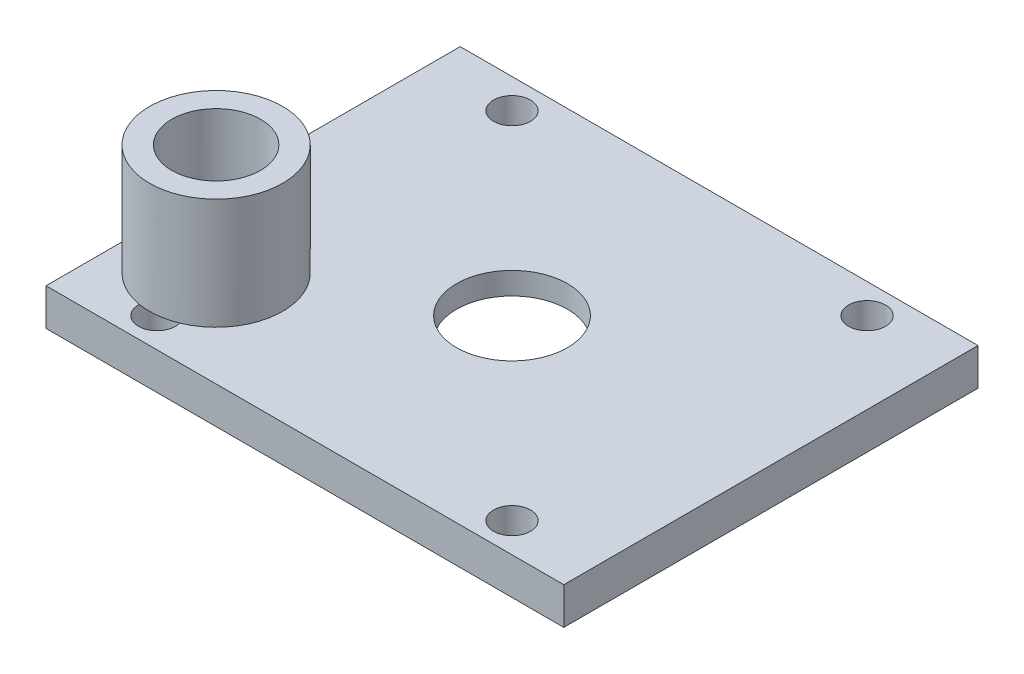
ISO-10303-21;
HEADER;
FILE_DESCRIPTION(('STEP AP214'),'2;1');
FILE_NAME('part.step','',(''),(''),'','','');
FILE_SCHEMA(('AUTOMOTIVE_DESIGN { 1 0 10303 214 1 1 1 1 }'));
ENDSEC;
DATA;
#1=APPLICATION_CONTEXT('core data for automotive mechanical design processes');
#2=APPLICATION_PROTOCOL_DEFINITION('international standard','automotive_design',2000,#1);
#3=PRODUCT_CONTEXT('',#1,'mechanical');
#4=PRODUCT('Part','Part','',(#3));
#5=PRODUCT_RELATED_PRODUCT_CATEGORY('part','',(#4));
#6=PRODUCT_DEFINITION_FORMATION('','',#4);
#7=PRODUCT_DEFINITION_CONTEXT('part definition',#1,'design');
#8=PRODUCT_DEFINITION('design','',#6,#7);
#9=PRODUCT_DEFINITION_SHAPE('','',#8);
#10=(LENGTH_UNIT() NAMED_UNIT(*) SI_UNIT(.MILLI.,.METRE.));
#11=(NAMED_UNIT(*) PLANE_ANGLE_UNIT() SI_UNIT($,.RADIAN.));
#12=(NAMED_UNIT(*) SI_UNIT($,.STERADIAN.) SOLID_ANGLE_UNIT());
#13=UNCERTAINTY_MEASURE_WITH_UNIT(LENGTH_MEASURE(1.E-05),#10,'distance_accuracy_value','');
#14=(GEOMETRIC_REPRESENTATION_CONTEXT(3) GLOBAL_UNCERTAINTY_ASSIGNED_CONTEXT((#13)) GLOBAL_UNIT_ASSIGNED_CONTEXT((#10,
#11,#12)) REPRESENTATION_CONTEXT('',''));
#15=CARTESIAN_POINT('',(0.,0.,0.));
#16=DIRECTION('',(0.,0.,1.));
#17=DIRECTION('',(1.,0.,0.));
#18=AXIS2_PLACEMENT_3D('',#15,#16,#17);
#19=CARTESIAN_POINT('',(35.,5.,28.));
#20=DIRECTION('',(-1.,0.,0.));
#21=DIRECTION('',(0.,0.,1.));
#22=AXIS2_PLACEMENT_3D('',#19,#20,#21);
#23=PLANE('',#22);
#24=DIRECTION('',(0.,0.,-1.));
#25=VECTOR('',#24,1.);
#26=CARTESIAN_POINT('',(35.,0.,28.));
#27=LINE('',#26,#25);
#28=CARTESIAN_POINT('',(35.,0.,28.));
#29=VERTEX_POINT('',#28);
#30=CARTESIAN_POINT('',(35.,0.,-28.));
#31=VERTEX_POINT('',#30);
#32=EDGE_CURVE('E133',#29,#31,#27,.T.);
#33=ORIENTED_EDGE('',*,*,#32,.T.);
#34=DIRECTION('',(0.,-1.,0.));
#35=VECTOR('',#34,1.);
#36=CARTESIAN_POINT('',(35.,5.,-28.));
#37=LINE('',#36,#35);
#38=CARTESIAN_POINT('',(35.,5.,-28.));
#39=VERTEX_POINT('',#38);
#40=EDGE_CURVE('E110',#39,#31,#37,.T.);
#41=ORIENTED_EDGE('',*,*,#40,.F.);
#42=DIRECTION('',(0.,0.,-1.));
#43=VECTOR('',#42,1.);
#44=CARTESIAN_POINT('',(35.,5.,28.));
#45=LINE('',#44,#43);
#46=CARTESIAN_POINT('',(35.,5.,28.));
#47=VERTEX_POINT('',#46);
#48=EDGE_CURVE('E126',#47,#39,#45,.T.);
#49=ORIENTED_EDGE('',*,*,#48,.F.);
#50=DIRECTION('',(0.,-1.,0.));
#51=VECTOR('',#50,1.);
#52=CARTESIAN_POINT('',(35.,5.,28.));
#53=LINE('',#52,#51);
#54=EDGE_CURVE('E121',#47,#29,#53,.T.);
#55=ORIENTED_EDGE('',*,*,#54,.T.);
#56=EDGE_LOOP('',(#33,#41,#49,#55));
#57=FACE_BOUND('',#56,.T.);
#58=ADVANCED_FACE('F39',(#57),#23,.F.);
#59=CARTESIAN_POINT('',(-35.,5.,-28.));
#60=DIRECTION('',(0.,0.,1.));
#61=DIRECTION('',(1.,0.,0.));
#62=AXIS2_PLACEMENT_3D('',#59,#60,#61);
#63=PLANE('',#62);
#64=DIRECTION('',(-1.,0.,0.));
#65=VECTOR('',#64,1.);
#66=CARTESIAN_POINT('',(-35.,0.,-28.));
#67=LINE('',#66,#65);
#68=CARTESIAN_POINT('',(-35.,0.,-28.));
#69=VERTEX_POINT('',#68);
#70=EDGE_CURVE('E130',#31,#69,#67,.T.);
#71=ORIENTED_EDGE('',*,*,#70,.T.);
#72=DIRECTION('',(0.,-1.,0.));
#73=VECTOR('',#72,1.);
#74=CARTESIAN_POINT('',(-35.,5.,-28.));
#75=LINE('',#74,#73);
#76=CARTESIAN_POINT('',(-35.,5.,-28.));
#77=VERTEX_POINT('',#76);
#78=EDGE_CURVE('E112',#77,#69,#75,.T.);
#79=ORIENTED_EDGE('',*,*,#78,.F.);
#80=DIRECTION('',(-1.,0.,0.));
#81=VECTOR('',#80,1.);
#82=CARTESIAN_POINT('',(-35.,5.,-28.));
#83=LINE('',#82,#81);
#84=EDGE_CURVE('E92',#39,#77,#83,.T.);
#85=ORIENTED_EDGE('',*,*,#84,.F.);
#86=ORIENTED_EDGE('',*,*,#40,.T.);
#87=EDGE_LOOP('',(#71,#79,#85,#86));
#88=FACE_BOUND('',#87,.T.);
#89=ADVANCED_FACE('F236',(#88),#63,.F.);
#90=CARTESIAN_POINT('',(-35.,5.,28.));
#91=DIRECTION('',(1.,0.,0.));
#92=DIRECTION('',(0.,0.,-1.));
#93=AXIS2_PLACEMENT_3D('',#90,#91,#92);
#94=PLANE('',#93);
#95=DIRECTION('',(0.,0.,1.));
#96=VECTOR('',#95,1.);
#97=CARTESIAN_POINT('',(-35.,0.,28.));
#98=LINE('',#97,#96);
#99=CARTESIAN_POINT('',(-35.,0.,28.));
#100=VERTEX_POINT('',#99);
#101=EDGE_CURVE('E127',#69,#100,#98,.T.);
#102=ORIENTED_EDGE('',*,*,#101,.T.);
#103=DIRECTION('',(0.,-1.,0.));
#104=VECTOR('',#103,1.);
#105=CARTESIAN_POINT('',(-35.,5.,28.));
#106=LINE('',#105,#104);
#107=CARTESIAN_POINT('',(-35.,5.,28.));
#108=VERTEX_POINT('',#107);
#109=EDGE_CURVE('E118',#108,#100,#106,.T.);
#110=ORIENTED_EDGE('',*,*,#109,.F.);
#111=DIRECTION('',(0.,0.,1.));
#112=VECTOR('',#111,1.);
#113=CARTESIAN_POINT('',(-35.,5.,28.));
#114=LINE('',#113,#112);
#115=EDGE_CURVE('E140',#77,#108,#114,.T.);
#116=ORIENTED_EDGE('',*,*,#115,.F.);
#117=ORIENTED_EDGE('',*,*,#78,.T.);
#118=EDGE_LOOP('',(#102,#110,#116,#117));
#119=FACE_BOUND('',#118,.T.);
#120=ADVANCED_FACE('F241',(#119),#94,.F.);
#121=CARTESIAN_POINT('',(-35.,5.,28.));
#122=DIRECTION('',(0.,0.,-1.));
#123=DIRECTION('',(-1.,0.,0.));
#124=AXIS2_PLACEMENT_3D('',#121,#122,#123);
#125=PLANE('',#124);
#126=DIRECTION('',(1.,0.,0.));
#127=VECTOR('',#126,1.);
#128=CARTESIAN_POINT('',(-35.,0.,28.));
#129=LINE('',#128,#127);
#130=EDGE_CURVE('E84',#100,#29,#129,.T.);
#131=ORIENTED_EDGE('',*,*,#130,.T.);
#132=ORIENTED_EDGE('',*,*,#54,.F.);
#133=DIRECTION('',(1.,0.,0.));
#134=VECTOR('',#133,1.);
#135=CARTESIAN_POINT('',(-35.,5.,28.));
#136=LINE('',#135,#134);
#137=EDGE_CURVE('E63',#108,#47,#136,.T.);
#138=ORIENTED_EDGE('',*,*,#137,.F.);
#139=ORIENTED_EDGE('',*,*,#109,.T.);
#140=EDGE_LOOP('',(#131,#132,#138,#139));
#141=FACE_BOUND('',#140,.T.);
#142=ADVANCED_FACE('F211',(#141),#125,.F.);
#143=CARTESIAN_POINT('',(0.,5.,0.));
#144=DIRECTION('',(0.,-1.,0.));
#145=DIRECTION('',(0.,0.,-1.));
#146=AXIS2_PLACEMENT_3D('',#143,#144,#145);
#147=PLANE('',#146);
#148=CARTESIAN_POINT('',(24.0000000000014,5.,23.9999999999986));
#149=DIRECTION('',(0.,1.,0.));
#150=DIRECTION('',(0.,0.,1.));
#151=AXIS2_PLACEMENT_3D('',#148,#149,#150);
#152=CIRCLE('',#151,2.5000000000019);
#153=CARTESIAN_POINT('',(24.0000000000014,5.,26.5000000000005));
#154=VERTEX_POINT('',#153);
#155=EDGE_CURVE('E182',#154,#154,#152,.T.);
#156=ORIENTED_EDGE('',*,*,#155,.F.);
#157=EDGE_LOOP('',(#156));
#158=FACE_BOUND('',#157,.T.);
#159=CARTESIAN_POINT('',(24.,5.,-24.0000000000014));
#160=DIRECTION('',(0.,1.,0.));
#161=DIRECTION('',(0.,0.,1.));
#162=AXIS2_PLACEMENT_3D('',#159,#160,#161);
#163=CIRCLE('',#162,2.5000000000014);
#164=CARTESIAN_POINT('',(24.,5.,-21.5));
#165=VERTEX_POINT('',#164);
#166=EDGE_CURVE('E190',#165,#165,#163,.T.);
#167=ORIENTED_EDGE('',*,*,#166,.F.);
#168=EDGE_LOOP('',(#167));
#169=FACE_BOUND('',#168,.T.);
#170=CARTESIAN_POINT('',(-24.,5.,-24.));
#171=DIRECTION('',(0.,1.,0.));
#172=DIRECTION('',(0.,0.,1.));
#173=AXIS2_PLACEMENT_3D('',#170,#171,#172);
#174=CIRCLE('',#173,2.5);
#175=CARTESIAN_POINT('',(-24.,5.,-21.5));
#176=VERTEX_POINT('',#175);
#177=EDGE_CURVE('E171',#176,#176,#174,.T.);
#178=ORIENTED_EDGE('',*,*,#177,.F.);
#179=EDGE_LOOP('',(#178));
#180=FACE_BOUND('',#179,.T.);
#181=CARTESIAN_POINT('',(0.,5.,0.));
#182=DIRECTION('',(0.,-1.,0.));
#183=DIRECTION('',(0.,0.,-1.));
#184=AXIS2_PLACEMENT_3D('',#181,#182,#183);
#185=CIRCLE('',#184,7.5);
#186=CARTESIAN_POINT('',(0.,5.,-7.5));
#187=VERTEX_POINT('',#186);
#188=EDGE_CURVE('E155',#187,#187,#185,.T.);
#189=ORIENTED_EDGE('',*,*,#188,.T.);
#190=EDGE_LOOP('',(#189));
#191=FACE_BOUND('',#190,.T.);
#192=CARTESIAN_POINT('',(-25.,5.,15.));
#193=DIRECTION('',(0.,-1.,0.));
#194=DIRECTION('',(0.,0.,-1.));
#195=AXIS2_PLACEMENT_3D('',#192,#193,#194);
#196=CIRCLE('',#195,9.);
#197=CARTESIAN_POINT('',(-21.5915591053831,5.,23.3296176783753));
#198=VERTEX_POINT('',#197);
#199=CARTESIAN_POINT('',(-26.4968555287608,5.,23.8746506143069));
#200=VERTEX_POINT('',#199);
#201=EDGE_CURVE('E48',#198,#200,#196,.F.);
#202=ORIENTED_EDGE('',*,*,#201,.F.);
#203=CARTESIAN_POINT('',(-23.9999999999986,5.,24.));
#204=DIRECTION('',(0.,1.,0.));
#205=DIRECTION('',(0.,0.,1.));
#206=AXIS2_PLACEMENT_3D('',#203,#204,#205);
#207=CIRCLE('',#206,2.50000000000071);
#208=EDGE_CURVE('E100',#200,#198,#207,.T.);
#209=ORIENTED_EDGE('',*,*,#208,.F.);
#210=EDGE_LOOP('',(#202,#209));
#211=FACE_BOUND('',#210,.T.);
#212=ORIENTED_EDGE('',*,*,#48,.T.);
#213=ORIENTED_EDGE('',*,*,#84,.T.);
#214=ORIENTED_EDGE('',*,*,#115,.T.);
#215=ORIENTED_EDGE('',*,*,#137,.T.);
#216=EDGE_LOOP('',(#212,#213,#214,#215));
#217=FACE_BOUND('',#216,.T.);
#218=ADVANCED_FACE('F106',(#158,#169,#180,#191,#211,#217),#147,.F.);
#219=CARTESIAN_POINT('',(0.,0.,0.));
#220=DIRECTION('',(0.,-1.,0.));
#221=DIRECTION('',(0.,0.,-1.));
#222=AXIS2_PLACEMENT_3D('',#219,#220,#221);
#223=PLANE('',#222);
#224=CARTESIAN_POINT('',(-23.9999999999986,0.,24.));
#225=DIRECTION('',(0.,1.,0.));
#226=DIRECTION('',(0.,0.,1.));
#227=AXIS2_PLACEMENT_3D('',#224,#225,#226);
#228=CIRCLE('',#227,2.50000000000071);
#229=CARTESIAN_POINT('',(-23.9999999999986,0.,26.5000000000007));
#230=VERTEX_POINT('',#229);
#231=EDGE_CURVE('E103',#230,#230,#228,.T.);
#232=ORIENTED_EDGE('',*,*,#231,.T.);
#233=EDGE_LOOP('',(#232));
#234=FACE_BOUND('',#233,.T.);
#235=CARTESIAN_POINT('',(24.0000000000014,0.,23.9999999999986));
#236=DIRECTION('',(0.,1.,0.));
#237=DIRECTION('',(0.,0.,1.));
#238=AXIS2_PLACEMENT_3D('',#235,#236,#237);
#239=CIRCLE('',#238,2.5000000000019);
#240=CARTESIAN_POINT('',(24.0000000000014,0.,26.5000000000005));
#241=VERTEX_POINT('',#240);
#242=EDGE_CURVE('E186',#241,#241,#239,.T.);
#243=ORIENTED_EDGE('',*,*,#242,.T.);
#244=EDGE_LOOP('',(#243));
#245=FACE_BOUND('',#244,.T.);
#246=CARTESIAN_POINT('',(24.,0.,-24.0000000000014));
#247=DIRECTION('',(0.,1.,0.));
#248=DIRECTION('',(0.,0.,1.));
#249=AXIS2_PLACEMENT_3D('',#246,#247,#248);
#250=CIRCLE('',#249,2.5000000000014);
#251=CARTESIAN_POINT('',(24.,0.,-21.5));
#252=VERTEX_POINT('',#251);
#253=EDGE_CURVE('E175',#252,#252,#250,.T.);
#254=ORIENTED_EDGE('',*,*,#253,.T.);
#255=EDGE_LOOP('',(#254));
#256=FACE_BOUND('',#255,.T.);
#257=CARTESIAN_POINT('',(-24.,0.,-24.));
#258=DIRECTION('',(0.,1.,0.));
#259=DIRECTION('',(0.,0.,1.));
#260=AXIS2_PLACEMENT_3D('',#257,#258,#259);
#261=CIRCLE('',#260,2.5);
#262=CARTESIAN_POINT('',(-24.,0.,-21.5));
#263=VERTEX_POINT('',#262);
#264=EDGE_CURVE('E170',#263,#263,#261,.T.);
#265=ORIENTED_EDGE('',*,*,#264,.T.);
#266=EDGE_LOOP('',(#265));
#267=FACE_BOUND('',#266,.T.);
#268=CARTESIAN_POINT('',(0.,0.,0.));
#269=DIRECTION('',(0.,-1.,0.));
#270=DIRECTION('',(0.,0.,-1.));
#271=AXIS2_PLACEMENT_3D('',#268,#269,#270);
#272=CIRCLE('',#271,19.);
#273=CARTESIAN_POINT('',(0.,0.,-19.));
#274=VERTEX_POINT('',#273);
#275=EDGE_CURVE('E151',#274,#274,#272,.T.);
#276=ORIENTED_EDGE('',*,*,#275,.F.);
#277=EDGE_LOOP('',(#276));
#278=FACE_BOUND('',#277,.T.);
#279=ORIENTED_EDGE('',*,*,#32,.F.);
#280=ORIENTED_EDGE('',*,*,#130,.F.);
#281=ORIENTED_EDGE('',*,*,#101,.F.);
#282=ORIENTED_EDGE('',*,*,#70,.F.);
#283=EDGE_LOOP('',(#279,#280,#281,#282));
#284=FACE_BOUND('',#283,.T.);
#285=ADVANCED_FACE('F198',(#234,#245,#256,#267,#278,#284),#223,.T.);
#286=CARTESIAN_POINT('',(-25.,20.,15.));
#287=DIRECTION('',(0.,-1.,0.));
#288=DIRECTION('',(0.,0.,-1.));
#289=AXIS2_PLACEMENT_3D('',#286,#287,#288);
#290=CYLINDRICAL_SURFACE('',#289,9.);
#291=CARTESIAN_POINT('',(-25.,20.,15.));
#292=DIRECTION('',(0.,1.,0.));
#293=DIRECTION('',(0.,0.,1.));
#294=AXIS2_PLACEMENT_3D('',#291,#292,#293);
#295=CIRCLE('',#294,9.);
#296=CARTESIAN_POINT('',(-25.,20.,24.));
#297=VERTEX_POINT('',#296);
#298=EDGE_CURVE('E137',#297,#297,#295,.T.);
#299=ORIENTED_EDGE('',*,*,#298,.F.);
#300=EDGE_LOOP('',(#299));
#301=FACE_BOUND('',#300,.T.);
#302=EDGE_CURVE('E11',#200,#198,#196,.F.);
#303=ORIENTED_EDGE('',*,*,#302,.T.);
#304=ORIENTED_EDGE('',*,*,#201,.T.);
#305=EDGE_LOOP('',(#303,#304));
#306=FACE_BOUND('',#305,.T.);
#307=ADVANCED_FACE('F108',(#301,#306),#290,.T.);
#308=CARTESIAN_POINT('',(-25.,20.,15.));
#309=DIRECTION('',(0.,1.,0.));
#310=DIRECTION('',(0.,0.,1.));
#311=AXIS2_PLACEMENT_3D('',#308,#309,#310);
#312=PLANE('',#311);
#313=CARTESIAN_POINT('',(-25.,20.,15.));
#314=DIRECTION('',(0.,1.,0.));
#315=DIRECTION('',(0.,0.,1.));
#316=AXIS2_PLACEMENT_3D('',#313,#314,#315);
#317=CIRCLE('',#316,6.);
#318=CARTESIAN_POINT('',(-25.,20.,21.));
#319=VERTEX_POINT('',#318);
#320=EDGE_CURVE('E166',#319,#319,#317,.T.);
#321=ORIENTED_EDGE('',*,*,#320,.F.);
#322=EDGE_LOOP('',(#321));
#323=FACE_BOUND('',#322,.T.);
#324=ORIENTED_EDGE('',*,*,#298,.T.);
#325=EDGE_LOOP('',(#324));
#326=FACE_BOUND('',#325,.T.);
#327=ADVANCED_FACE('F262',(#323,#326),#312,.T.);
#328=CARTESIAN_POINT('',(0.,2.,0.));
#329=DIRECTION('',(0.,-1.,0.));
#330=DIRECTION('',(0.,0.,-1.));
#331=AXIS2_PLACEMENT_3D('',#328,#329,#330);
#332=CYLINDRICAL_SURFACE('',#331,19.);
#333=CARTESIAN_POINT('',(0.,2.,0.));
#334=DIRECTION('',(0.,-1.,0.));
#335=DIRECTION('',(0.,0.,-1.));
#336=AXIS2_PLACEMENT_3D('',#333,#334,#335);
#337=CIRCLE('',#336,19.);
#338=CARTESIAN_POINT('',(0.,2.,-19.));
#339=VERTEX_POINT('',#338);
#340=EDGE_CURVE('E150',#339,#339,#337,.T.);
#341=ORIENTED_EDGE('',*,*,#340,.F.);
#342=EDGE_LOOP('',(#341));
#343=FACE_BOUND('',#342,.T.);
#344=ORIENTED_EDGE('',*,*,#275,.T.);
#345=EDGE_LOOP('',(#344));
#346=FACE_BOUND('',#345,.T.);
#347=ADVANCED_FACE('F231',(#343,#346),#332,.F.);
#348=CARTESIAN_POINT('',(0.,2.,0.));
#349=DIRECTION('',(0.,-1.,0.));
#350=DIRECTION('',(0.,0.,-1.));
#351=AXIS2_PLACEMENT_3D('',#348,#349,#350);
#352=PLANE('',#351);
#353=CARTESIAN_POINT('',(0.,2.,0.));
#354=DIRECTION('',(0.,-1.,0.));
#355=DIRECTION('',(0.,0.,-1.));
#356=AXIS2_PLACEMENT_3D('',#353,#354,#355);
#357=CIRCLE('',#356,7.5);
#358=CARTESIAN_POINT('',(0.,2.,-7.5));
#359=VERTEX_POINT('',#358);
#360=EDGE_CURVE('E42',#359,#359,#357,.T.);
#361=ORIENTED_EDGE('',*,*,#360,.F.);
#362=EDGE_LOOP('',(#361));
#363=FACE_BOUND('',#362,.T.);
#364=ORIENTED_EDGE('',*,*,#340,.T.);
#365=EDGE_LOOP('',(#364));
#366=FACE_BOUND('',#365,.T.);
#367=ADVANCED_FACE('F221',(#363,#366),#352,.T.);
#368=CARTESIAN_POINT('',(0.,20.,0.));
#369=DIRECTION('',(0.,-1.,0.));
#370=DIRECTION('',(0.,0.,-1.));
#371=AXIS2_PLACEMENT_3D('',#368,#369,#370);
#372=CYLINDRICAL_SURFACE('',#371,7.5);
#373=ORIENTED_EDGE('',*,*,#360,.T.);
#374=EDGE_LOOP('',(#373));
#375=FACE_BOUND('',#374,.T.);
#376=ORIENTED_EDGE('',*,*,#188,.F.);
#377=EDGE_LOOP('',(#376));
#378=FACE_BOUND('',#377,.T.);
#379=ADVANCED_FACE('F218',(#375,#378),#372,.F.);
#380=CARTESIAN_POINT('',(0.,5.,0.));
#381=DIRECTION('',(0.,-1.,0.));
#382=DIRECTION('',(0.,0.,-1.));
#383=AXIS2_PLACEMENT_3D('',#380,#381,#382);
#384=PLANE('',#383);
#385=CARTESIAN_POINT('',(-25.,5.,15.));
#386=DIRECTION('',(0.,-1.,0.));
#387=DIRECTION('',(0.,0.,-1.));
#388=AXIS2_PLACEMENT_3D('',#385,#386,#387);
#389=CIRCLE('',#388,6.);
#390=CARTESIAN_POINT('',(-25.,5.,9.));
#391=VERTEX_POINT('',#390);
#392=EDGE_CURVE('E162',#391,#391,#389,.F.);
#393=ORIENTED_EDGE('',*,*,#392,.T.);
#394=EDGE_LOOP('',(#393));
#395=FACE_BOUND('',#394,.T.);
#396=ADVANCED_FACE('F220',(#395),#384,.F.);
#397=CARTESIAN_POINT('',(-25.,-11.9705627484771,15.));
#398=DIRECTION('',(0.,1.,0.));
#399=DIRECTION('',(0.,0.,1.));
#400=AXIS2_PLACEMENT_3D('',#397,#398,#399);
#401=CYLINDRICAL_SURFACE('',#400,6.);
#402=ORIENTED_EDGE('',*,*,#320,.T.);
#403=EDGE_LOOP('',(#402));
#404=FACE_BOUND('',#403,.T.);
#405=ORIENTED_EDGE('',*,*,#392,.F.);
#406=EDGE_LOOP('',(#405));
#407=FACE_BOUND('',#406,.T.);
#408=ADVANCED_FACE('F228',(#404,#407),#401,.F.);
#409=CARTESIAN_POINT('',(-23.9999999999986,5.,24.));
#410=DIRECTION('',(0.,1.,0.));
#411=DIRECTION('',(0.,0.,1.));
#412=AXIS2_PLACEMENT_3D('',#409,#410,#411);
#413=PLANE('',#412);
#414=EDGE_CURVE('E54',#198,#200,#207,.T.);
#415=ORIENTED_EDGE('',*,*,#414,.F.);
#416=ORIENTED_EDGE('',*,*,#302,.F.);
#417=EDGE_LOOP('',(#415,#416));
#418=FACE_BOUND('',#417,.T.);
#419=ADVANCED_FACE('F94',(#418),#413,.F.);
#420=CARTESIAN_POINT('',(-23.9999999999986,0.,24.));
#421=DIRECTION('',(0.,1.,0.));
#422=DIRECTION('',(0.,0.,1.));
#423=AXIS2_PLACEMENT_3D('',#420,#421,#422);
#424=CYLINDRICAL_SURFACE('',#423,2.50000000000071);
#425=ORIENTED_EDGE('',*,*,#231,.F.);
#426=EDGE_LOOP('',(#425));
#427=FACE_BOUND('',#426,.T.);
#428=ORIENTED_EDGE('',*,*,#414,.T.);
#429=ORIENTED_EDGE('',*,*,#208,.T.);
#430=EDGE_LOOP('',(#428,#429));
#431=FACE_BOUND('',#430,.T.);
#432=ADVANCED_FACE('F99',(#427,#431),#424,.F.);
#433=CARTESIAN_POINT('',(-24.,0.,-24.));
#434=DIRECTION('',(0.,1.,0.));
#435=DIRECTION('',(0.,0.,1.));
#436=AXIS2_PLACEMENT_3D('',#433,#434,#435);
#437=CYLINDRICAL_SURFACE('',#436,2.5);
#438=ORIENTED_EDGE('',*,*,#264,.F.);
#439=EDGE_LOOP('',(#438));
#440=FACE_BOUND('',#439,.T.);
#441=ORIENTED_EDGE('',*,*,#177,.T.);
#442=EDGE_LOOP('',(#441));
#443=FACE_BOUND('',#442,.T.);
#444=ADVANCED_FACE('F205',(#440,#443),#437,.F.);
#445=CARTESIAN_POINT('',(24.,0.,-24.0000000000014));
#446=DIRECTION('',(0.,1.,0.));
#447=DIRECTION('',(0.,0.,1.));
#448=AXIS2_PLACEMENT_3D('',#445,#446,#447);
#449=CYLINDRICAL_SURFACE('',#448,2.5000000000014);
#450=ORIENTED_EDGE('',*,*,#253,.F.);
#451=EDGE_LOOP('',(#450));
#452=FACE_BOUND('',#451,.T.);
#453=ORIENTED_EDGE('',*,*,#166,.T.);
#454=EDGE_LOOP('',(#453));
#455=FACE_BOUND('',#454,.T.);
#456=ADVANCED_FACE('F201',(#452,#455),#449,.F.);
#457=CARTESIAN_POINT('',(24.0000000000014,0.,23.9999999999986));
#458=DIRECTION('',(0.,1.,0.));
#459=DIRECTION('',(0.,0.,1.));
#460=AXIS2_PLACEMENT_3D('',#457,#458,#459);
#461=CYLINDRICAL_SURFACE('',#460,2.5000000000019);
#462=ORIENTED_EDGE('',*,*,#242,.F.);
#463=EDGE_LOOP('',(#462));
#464=FACE_BOUND('',#463,.T.);
#465=ORIENTED_EDGE('',*,*,#155,.T.);
#466=EDGE_LOOP('',(#465));
#467=FACE_BOUND('',#466,.T.);
#468=ADVANCED_FACE('F204',(#464,#467),#461,.F.);
#469=CLOSED_SHELL('',(#58,#89,#120,#142,#218,#285,#307,#327,#347,#367,#379,#396,#408,#419,#432,
#444,#456,#468));
#470=MANIFOLD_SOLID_BREP('B2',#469);
#471=ADVANCED_BREP_SHAPE_REPRESENTATION('',(#18,#470),#14);
#472=SHAPE_DEFINITION_REPRESENTATION(#9,#471);
ENDSEC;
END-ISO-10303-21;
